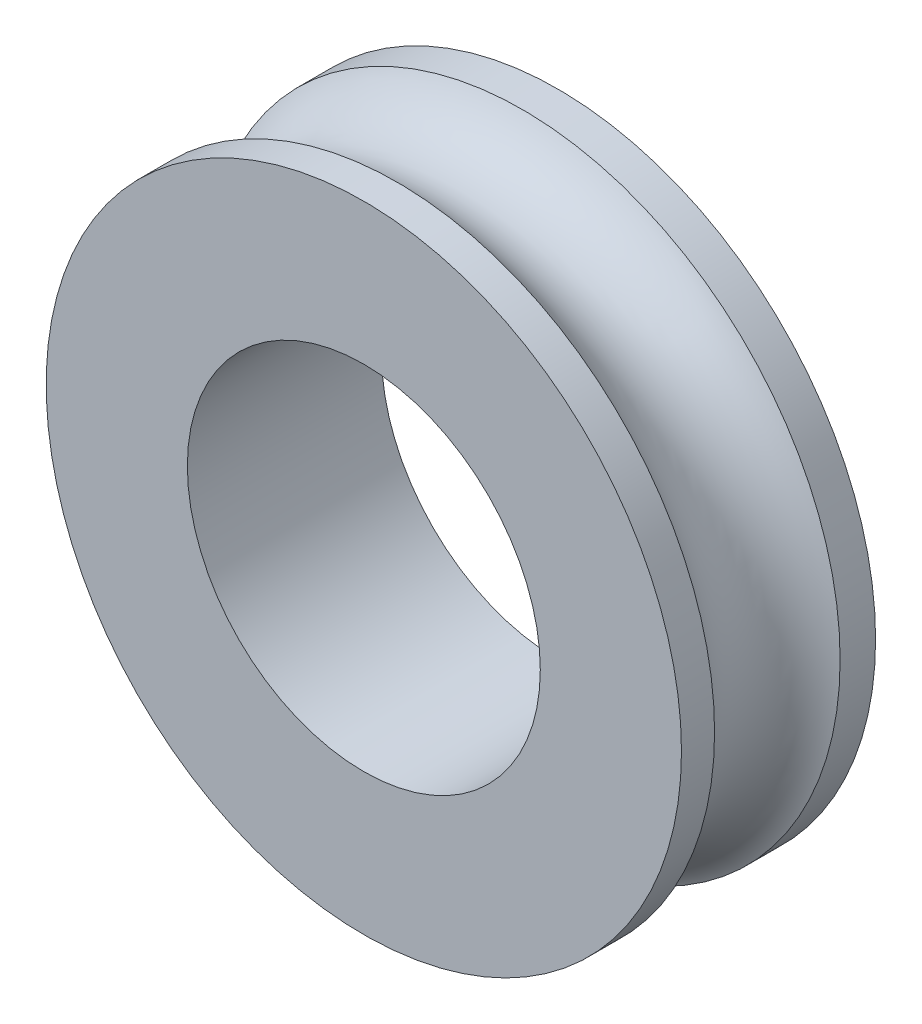
ISO-10303-21;
HEADER;
FILE_DESCRIPTION(('STEP AP214'),'2;1');
FILE_NAME('part.step','',(''),(''),'','','');
FILE_SCHEMA(('AUTOMOTIVE_DESIGN { 1 0 10303 214 1 1 1 1 }'));
ENDSEC;
DATA;
#1=APPLICATION_CONTEXT('core data for automotive mechanical design processes');
#2=APPLICATION_PROTOCOL_DEFINITION('international standard','automotive_design',2000,#1);
#3=PRODUCT_CONTEXT('',#1,'mechanical');
#4=PRODUCT('Part','Part','',(#3));
#5=PRODUCT_RELATED_PRODUCT_CATEGORY('part','',(#4));
#6=PRODUCT_DEFINITION_FORMATION('','',#4);
#7=PRODUCT_DEFINITION_CONTEXT('part definition',#1,'design');
#8=PRODUCT_DEFINITION('design','',#6,#7);
#9=PRODUCT_DEFINITION_SHAPE('','',#8);
#10=(LENGTH_UNIT() NAMED_UNIT(*) SI_UNIT(.MILLI.,.METRE.));
#11=(NAMED_UNIT(*) PLANE_ANGLE_UNIT() SI_UNIT($,.RADIAN.));
#12=(NAMED_UNIT(*) SI_UNIT($,.STERADIAN.) SOLID_ANGLE_UNIT());
#13=UNCERTAINTY_MEASURE_WITH_UNIT(LENGTH_MEASURE(1.E-05),#10,'distance_accuracy_value','');
#14=(GEOMETRIC_REPRESENTATION_CONTEXT(3) GLOBAL_UNCERTAINTY_ASSIGNED_CONTEXT((#13)) GLOBAL_UNIT_ASSIGNED_CONTEXT((#10,
#11,#12)) REPRESENTATION_CONTEXT('',''));
#15=CARTESIAN_POINT('',(0.,0.,0.));
#16=DIRECTION('',(0.,0.,1.));
#17=DIRECTION('',(1.,0.,0.));
#18=AXIS2_PLACEMENT_3D('',#15,#16,#17);
#19=CARTESIAN_POINT('',(0.,0.,5.5));
#20=DIRECTION('',(0.,0.,-1.));
#21=DIRECTION('',(-1.,0.,0.));
#22=AXIS2_PLACEMENT_3D('',#19,#20,#21);
#23=CYLINDRICAL_SURFACE('',#22,9.);
#24=CARTESIAN_POINT('',(0.,0.,0.));
#25=DIRECTION('',(0.,0.,1.));
#26=DIRECTION('',(1.,0.,0.));
#27=AXIS2_PLACEMENT_3D('',#24,#25,#26);
#28=CIRCLE('',#27,9.);
#29=CARTESIAN_POINT('',(9.,0.,0.));
#30=VERTEX_POINT('',#29);
#31=EDGE_CURVE('E59',#30,#30,#28,.T.);
#32=ORIENTED_EDGE('',*,*,#31,.T.);
#33=EDGE_LOOP('',(#32));
#34=FACE_BOUND('',#33,.T.);
#35=CARTESIAN_POINT('',(0.,0.,1.00492409835216));
#36=DIRECTION('',(0.,0.,1.));
#37=DIRECTION('',(1.,0.,0.));
#38=AXIS2_PLACEMENT_3D('',#35,#36,#37);
#39=CIRCLE('',#38,9.);
#40=CARTESIAN_POINT('',(9.,0.,1.00492409835216));
#41=VERTEX_POINT('',#40);
#42=EDGE_CURVE('E11',#41,#41,#39,.T.);
#43=ORIENTED_EDGE('',*,*,#42,.F.);
#44=EDGE_LOOP('',(#43));
#45=FACE_BOUND('',#44,.T.);
#46=ADVANCED_FACE('F35',(#34,#45),#23,.T.);
#47=CARTESIAN_POINT('',(0.,0.,5.5));
#48=DIRECTION('',(0.,0.,1.));
#49=DIRECTION('',(1.,0.,0.));
#50=AXIS2_PLACEMENT_3D('',#47,#48,#49);
#51=CIRCLE('',#50,9.);
#52=CARTESIAN_POINT('',(9.,0.,5.5));
#53=VERTEX_POINT('',#52);
#54=EDGE_CURVE('E61',#53,#53,#51,.T.);
#55=ORIENTED_EDGE('',*,*,#54,.F.);
#56=EDGE_LOOP('',(#55));
#57=FACE_BOUND('',#56,.T.);
#58=CARTESIAN_POINT('',(0.,0.,4.56213157132027));
#59=DIRECTION('',(0.,0.,-1.));
#60=DIRECTION('',(-1.,0.,0.));
#61=AXIS2_PLACEMENT_3D('',#58,#59,#60);
#62=CIRCLE('',#61,9.);
#63=CARTESIAN_POINT('',(9.,0.,4.56213157132027));
#64=VERTEX_POINT('',#63);
#65=EDGE_CURVE('E42',#64,#64,#62,.T.);
#66=ORIENTED_EDGE('',*,*,#65,.F.);
#67=EDGE_LOOP('',(#66));
#68=FACE_BOUND('',#67,.T.);
#69=ADVANCED_FACE('F85',(#57,#68),#23,.T.);
#70=CARTESIAN_POINT('',(0.,0.,5.5));
#71=DIRECTION('',(0.,0.,1.));
#72=DIRECTION('',(1.,0.,0.));
#73=AXIS2_PLACEMENT_3D('',#70,#71,#72);
#74=PLANE('',#73);
#75=ORIENTED_EDGE('',*,*,#54,.T.);
#76=EDGE_LOOP('',(#75));
#77=FACE_BOUND('',#76,.T.);
#78=CARTESIAN_POINT('',(0.,0.,5.5));
#79=DIRECTION('',(0.,0.,1.));
#80=DIRECTION('',(1.,0.,0.));
#81=AXIS2_PLACEMENT_3D('',#78,#79,#80);
#82=CIRCLE('',#81,5.);
#83=CARTESIAN_POINT('',(5.,0.,5.5));
#84=VERTEX_POINT('',#83);
#85=EDGE_CURVE('E55',#84,#84,#82,.T.);
#86=ORIENTED_EDGE('',*,*,#85,.F.);
#87=EDGE_LOOP('',(#86));
#88=FACE_BOUND('',#87,.T.);
#89=ADVANCED_FACE('F73',(#77,#88),#74,.T.);
#90=CARTESIAN_POINT('',(0.,0.,0.));
#91=DIRECTION('',(0.,0.,1.));
#92=DIRECTION('',(1.,0.,0.));
#93=AXIS2_PLACEMENT_3D('',#90,#91,#92);
#94=PLANE('',#93);
#95=ORIENTED_EDGE('',*,*,#31,.F.);
#96=EDGE_LOOP('',(#95));
#97=FACE_BOUND('',#96,.T.);
#98=CARTESIAN_POINT('',(0.,0.,0.));
#99=DIRECTION('',(0.,0.,1.));
#100=DIRECTION('',(1.,0.,0.));
#101=AXIS2_PLACEMENT_3D('',#98,#99,#100);
#102=CIRCLE('',#101,5.);
#103=CARTESIAN_POINT('',(5.,0.,0.));
#104=VERTEX_POINT('',#103);
#105=EDGE_CURVE('E52',#104,#104,#102,.T.);
#106=ORIENTED_EDGE('',*,*,#105,.T.);
#107=EDGE_LOOP('',(#106));
#108=FACE_BOUND('',#107,.T.);
#109=ADVANCED_FACE('F69',(#97,#108),#94,.F.);
#110=CARTESIAN_POINT('',(0.,0.,5.5));
#111=DIRECTION('',(0.,0.,-1.));
#112=DIRECTION('',(-1.,0.,0.));
#113=AXIS2_PLACEMENT_3D('',#110,#111,#112);
#114=CYLINDRICAL_SURFACE('',#113,5.);
#115=ORIENTED_EDGE('',*,*,#85,.T.);
#116=EDGE_LOOP('',(#115));
#117=FACE_BOUND('',#116,.T.);
#118=ORIENTED_EDGE('',*,*,#105,.F.);
#119=EDGE_LOOP('',(#118));
#120=FACE_BOUND('',#119,.T.);
#121=ADVANCED_FACE('F72',(#117,#120),#114,.F.);
#122=CARTESIAN_POINT('',(0.,0.,2.78352783483622));
#123=DIRECTION('',(0.,0.,-1.));
#124=DIRECTION('',(-1.,0.,0.));
#125=AXIS2_PLACEMENT_3D('',#122,#123,#124);
#126=TOROIDAL_SURFACE('',#125,9.91082797758529,1.99825895623844);
#127=ORIENTED_EDGE('',*,*,#42,.T.);
#128=CARTESIAN_POINT('',(9.91082797758529,0.,2.78352783483622));
#129=DIRECTION('',(0.,1.,0.));
#130=DIRECTION('',(0.,0.,1.));
#131=AXIS2_PLACEMENT_3D('',#128,#129,#130);
#132=CIRCLE('',#131,1.99825895623844);
#133=EDGE_CURVE('E48',#41,#64,#132,.T.);
#134=ORIENTED_EDGE('',*,*,#133,.T.);
#135=ORIENTED_EDGE('',*,*,#65,.T.);
#136=ORIENTED_EDGE('',*,*,#133,.F.);
#137=EDGE_LOOP('',(#127,#134,#135,#136));
#138=FACE_BOUND('',#137,.T.);
#139=ADVANCED_FACE('F49',(#138),#126,.F.);
#140=CLOSED_SHELL('',(#46,#69,#89,#109,#121,#139));
#141=MANIFOLD_SOLID_BREP('B2',#140);
#142=ADVANCED_BREP_SHAPE_REPRESENTATION('',(#18,#141),#14);
#143=SHAPE_DEFINITION_REPRESENTATION(#9,#142);
ENDSEC;
END-ISO-10303-21;
